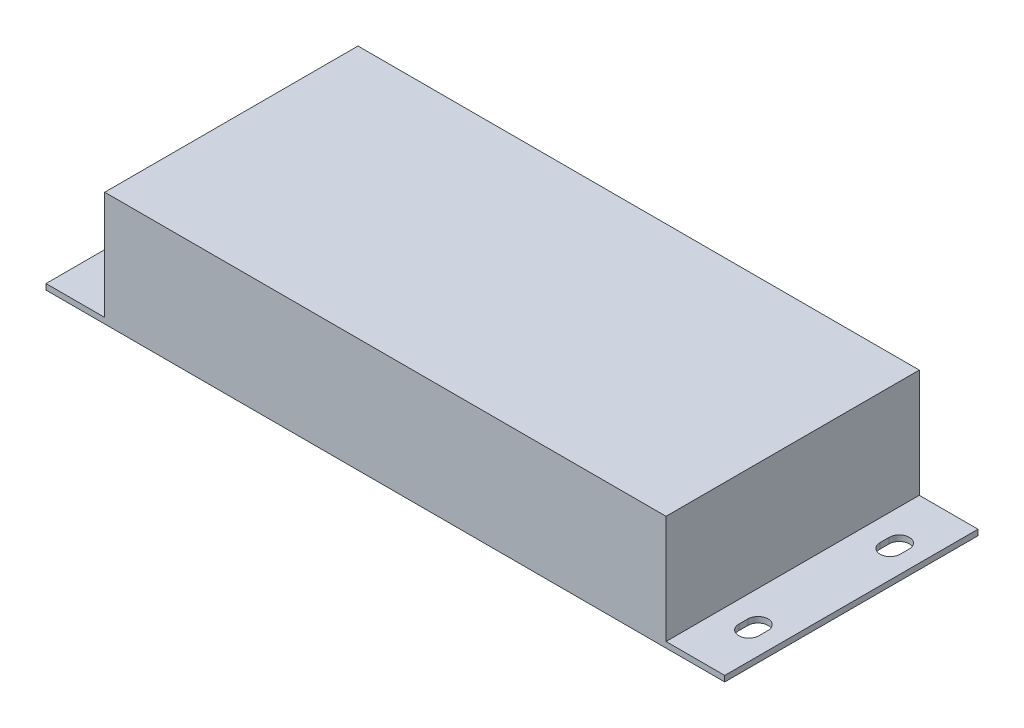
ISO-10303-21;
HEADER;
FILE_DESCRIPTION(('STEP AP214'),'2;1');
FILE_NAME('part.step','',(''),(''),'','','');
FILE_SCHEMA(('AUTOMOTIVE_DESIGN { 1 0 10303 214 1 1 1 1 }'));
ENDSEC;
DATA;
#1=APPLICATION_CONTEXT('core data for automotive mechanical design processes');
#2=APPLICATION_PROTOCOL_DEFINITION('international standard','automotive_design',2000,#1);
#3=PRODUCT_CONTEXT('',#1,'mechanical');
#4=PRODUCT('Part','Part','',(#3));
#5=PRODUCT_RELATED_PRODUCT_CATEGORY('part','',(#4));
#6=PRODUCT_DEFINITION_FORMATION('','',#4);
#7=PRODUCT_DEFINITION_CONTEXT('part definition',#1,'design');
#8=PRODUCT_DEFINITION('design','',#6,#7);
#9=PRODUCT_DEFINITION_SHAPE('','',#8);
#10=(LENGTH_UNIT() NAMED_UNIT(*) SI_UNIT(.MILLI.,.METRE.));
#11=(NAMED_UNIT(*) PLANE_ANGLE_UNIT() SI_UNIT($,.RADIAN.));
#12=(NAMED_UNIT(*) SI_UNIT($,.STERADIAN.) SOLID_ANGLE_UNIT());
#13=UNCERTAINTY_MEASURE_WITH_UNIT(LENGTH_MEASURE(1.E-05),#10,'distance_accuracy_value','');
#14=(GEOMETRIC_REPRESENTATION_CONTEXT(3) GLOBAL_UNCERTAINTY_ASSIGNED_CONTEXT((#13)) GLOBAL_UNIT_ASSIGNED_CONTEXT((#10,
#11,#12)) REPRESENTATION_CONTEXT('',''));
#15=CARTESIAN_POINT('',(0.,0.,0.));
#16=DIRECTION('',(0.,0.,1.));
#17=DIRECTION('',(1.,0.,0.));
#18=AXIS2_PLACEMENT_3D('',#15,#16,#17);
#19=CARTESIAN_POINT('',(0.,19.304,0.));
#20=DIRECTION('',(1.,0.,0.));
#21=DIRECTION('',(0.,0.,-1.));
#22=AXIS2_PLACEMENT_3D('',#19,#20,#21);
#23=PLANE('',#22);
#24=DIRECTION('',(0.,0.,1.));
#25=VECTOR('',#24,1.);
#26=CARTESIAN_POINT('',(0.,0.,0.));
#27=LINE('',#26,#25);
#28=CARTESIAN_POINT('',(0.,0.,-45.085));
#29=VERTEX_POINT('',#28);
#30=CARTESIAN_POINT('',(0.,0.,0.));
#31=VERTEX_POINT('',#30);
#32=EDGE_CURVE('E111',#29,#31,#27,.T.);
#33=ORIENTED_EDGE('',*,*,#32,.T.);
#34=DIRECTION('',(0.,-1.,0.));
#35=VECTOR('',#34,1.);
#36=CARTESIAN_POINT('',(0.,19.304,0.));
#37=LINE('',#36,#35);
#38=CARTESIAN_POINT('',(0.,19.304,0.));
#39=VERTEX_POINT('',#38);
#40=EDGE_CURVE('E11',#39,#31,#37,.T.);
#41=ORIENTED_EDGE('',*,*,#40,.F.);
#42=DIRECTION('',(0.,0.,1.));
#43=VECTOR('',#42,1.);
#44=CARTESIAN_POINT('',(0.,19.304,0.));
#45=LINE('',#44,#43);
#46=CARTESIAN_POINT('',(0.,19.304,-45.085));
#47=VERTEX_POINT('',#46);
#48=EDGE_CURVE('E92',#47,#39,#45,.T.);
#49=ORIENTED_EDGE('',*,*,#48,.F.);
#50=DIRECTION('',(0.,-1.,0.));
#51=VECTOR('',#50,1.);
#52=CARTESIAN_POINT('',(0.,19.304,-45.085));
#53=LINE('',#52,#51);
#54=EDGE_CURVE('E107',#47,#29,#53,.T.);
#55=ORIENTED_EDGE('',*,*,#54,.T.);
#56=EDGE_LOOP('',(#33,#41,#49,#55));
#57=FACE_BOUND('',#56,.T.);
#58=ADVANCED_FACE('F33',(#57),#23,.F.);
#59=CARTESIAN_POINT('',(0.,19.304,0.));
#60=DIRECTION('',(0.,0.,-1.));
#61=DIRECTION('',(-1.,0.,0.));
#62=AXIS2_PLACEMENT_3D('',#59,#60,#61);
#63=PLANE('',#62);
#64=ORIENTED_EDGE('',*,*,#40,.T.);
#65=DIRECTION('',(-1.,0.,0.));
#66=VECTOR('',#65,1.);
#67=CARTESIAN_POINT('',(-10.4521,0.,0.));
#68=LINE('',#67,#66);
#69=CARTESIAN_POINT('',(-10.4521,0.,0.));
#70=VERTEX_POINT('',#69);
#71=EDGE_CURVE('E80',#31,#70,#68,.T.);
#72=ORIENTED_EDGE('',*,*,#71,.T.);
#73=DIRECTION('',(0.,1.,0.));
#74=VECTOR('',#73,1.);
#75=CARTESIAN_POINT('',(-10.4521,-1.016,0.));
#76=LINE('',#75,#74);
#77=CARTESIAN_POINT('',(-10.4521,-1.016,0.));
#78=VERTEX_POINT('',#77);
#79=EDGE_CURVE('E131',#78,#70,#76,.T.);
#80=ORIENTED_EDGE('',*,*,#79,.F.);
#81=DIRECTION('',(-1.,0.,0.));
#82=VECTOR('',#81,1.);
#83=CARTESIAN_POINT('',(-10.4521,-1.016,0.));
#84=LINE('',#83,#82);
#85=CARTESIAN_POINT('',(110.3757,-1.016,0.));
#86=VERTEX_POINT('',#85);
#87=EDGE_CURVE('E154',#86,#78,#84,.T.);
#88=ORIENTED_EDGE('',*,*,#87,.F.);
#89=DIRECTION('',(0.,1.,0.));
#90=VECTOR('',#89,1.);
#91=CARTESIAN_POINT('',(110.3757,-1.016,0.));
#92=LINE('',#91,#90);
#93=CARTESIAN_POINT('',(110.3757,0.,0.));
#94=VERTEX_POINT('',#93);
#95=EDGE_CURVE('E115',#86,#94,#92,.T.);
#96=ORIENTED_EDGE('',*,*,#95,.T.);
#97=CARTESIAN_POINT('',(99.9236,0.,0.));
#98=VERTEX_POINT('',#97);
#99=EDGE_CURVE('E101',#94,#98,#68,.T.);
#100=ORIENTED_EDGE('',*,*,#99,.T.);
#101=DIRECTION('',(0.,-1.,0.));
#102=VECTOR('',#101,1.);
#103=CARTESIAN_POINT('',(99.9236,19.304,0.));
#104=LINE('',#103,#102);
#105=CARTESIAN_POINT('',(99.9236,19.304,0.));
#106=VERTEX_POINT('',#105);
#107=EDGE_CURVE('E40',#106,#98,#104,.T.);
#108=ORIENTED_EDGE('',*,*,#107,.F.);
#109=DIRECTION('',(1.,0.,0.));
#110=VECTOR('',#109,1.);
#111=CARTESIAN_POINT('',(0.,19.304,0.));
#112=LINE('',#111,#110);
#113=EDGE_CURVE('E85',#39,#106,#112,.T.);
#114=ORIENTED_EDGE('',*,*,#113,.F.);
#115=EDGE_LOOP('',(#64,#72,#80,#88,#96,#100,#108,#114));
#116=FACE_BOUND('',#115,.T.);
#117=ADVANCED_FACE('F98',(#116),#63,.F.);
#118=CARTESIAN_POINT('',(99.9236,19.304,0.));
#119=DIRECTION('',(-1.,0.,0.));
#120=DIRECTION('',(0.,0.,1.));
#121=AXIS2_PLACEMENT_3D('',#118,#119,#120);
#122=PLANE('',#121);
#123=DIRECTION('',(0.,0.,-1.));
#124=VECTOR('',#123,1.);
#125=CARTESIAN_POINT('',(99.9236,0.,0.));
#126=LINE('',#125,#124);
#127=CARTESIAN_POINT('',(99.9236,0.,-45.085));
#128=VERTEX_POINT('',#127);
#129=EDGE_CURVE('E114',#98,#128,#126,.T.);
#130=ORIENTED_EDGE('',*,*,#129,.T.);
#131=DIRECTION('',(0.,-1.,0.));
#132=VECTOR('',#131,1.);
#133=CARTESIAN_POINT('',(99.9236,19.304,-45.085));
#134=LINE('',#133,#132);
#135=CARTESIAN_POINT('',(99.9236,19.304,-45.085));
#136=VERTEX_POINT('',#135);
#137=EDGE_CURVE('E103',#136,#128,#134,.T.);
#138=ORIENTED_EDGE('',*,*,#137,.F.);
#139=DIRECTION('',(0.,0.,-1.));
#140=VECTOR('',#139,1.);
#141=CARTESIAN_POINT('',(99.9236,19.304,0.));
#142=LINE('',#141,#140);
#143=EDGE_CURVE('E89',#106,#136,#142,.T.);
#144=ORIENTED_EDGE('',*,*,#143,.F.);
#145=ORIENTED_EDGE('',*,*,#107,.T.);
#146=EDGE_LOOP('',(#130,#138,#144,#145));
#147=FACE_BOUND('',#146,.T.);
#148=ADVANCED_FACE('F104',(#147),#122,.F.);
#149=CARTESIAN_POINT('',(0.,19.304,-45.085));
#150=DIRECTION('',(0.,0.,1.));
#151=DIRECTION('',(1.,0.,0.));
#152=AXIS2_PLACEMENT_3D('',#149,#150,#151);
#153=PLANE('',#152);
#154=DIRECTION('',(-1.,0.,0.));
#155=VECTOR('',#154,1.);
#156=CARTESIAN_POINT('',(6.67170322778393,6.76181366277185,-45.085));
#157=LINE('',#156,#155);
#158=CARTESIAN_POINT('',(93.251896772216,6.76181366277185,-45.085));
#159=VERTEX_POINT('',#158);
#160=CARTESIAN_POINT('',(6.67170322778393,6.76181366277185,-45.085));
#161=VERTEX_POINT('',#160);
#162=EDGE_CURVE('E320',#159,#161,#157,.T.);
#163=ORIENTED_EDGE('',*,*,#162,.F.);
#164=DIRECTION('',(0.,-1.,0.));
#165=VECTOR('',#164,1.);
#166=CARTESIAN_POINT('',(93.251896772216,6.76181366277185,-45.085));
#167=LINE('',#166,#165);
#168=CARTESIAN_POINT('',(93.251896772216,12.5421863372281,-45.085));
#169=VERTEX_POINT('',#168);
#170=EDGE_CURVE('E47',#169,#159,#167,.T.);
#171=ORIENTED_EDGE('',*,*,#170,.F.);
#172=DIRECTION('',(1.,0.,0.));
#173=VECTOR('',#172,1.);
#174=CARTESIAN_POINT('',(6.67170322778393,12.5421863372281,-45.085));
#175=LINE('',#174,#173);
#176=CARTESIAN_POINT('',(6.67170322778393,12.5421863372281,-45.085));
#177=VERTEX_POINT('',#176);
#178=EDGE_CURVE('E313',#177,#169,#175,.T.);
#179=ORIENTED_EDGE('',*,*,#178,.F.);
#180=DIRECTION('',(0.,1.,0.));
#181=VECTOR('',#180,1.);
#182=CARTESIAN_POINT('',(6.67170322778393,6.76181366277185,-45.085));
#183=LINE('',#182,#181);
#184=EDGE_CURVE('E317',#161,#177,#183,.T.);
#185=ORIENTED_EDGE('',*,*,#184,.F.);
#186=EDGE_LOOP('',(#163,#171,#179,#185));
#187=FACE_BOUND('',#186,.T.);
#188=ORIENTED_EDGE('',*,*,#137,.T.);
#189=DIRECTION('',(1.,0.,0.));
#190=VECTOR('',#189,1.);
#191=CARTESIAN_POINT('',(-10.4521,0.,-45.085));
#192=LINE('',#191,#190);
#193=CARTESIAN_POINT('',(110.3757,0.,-45.085));
#194=VERTEX_POINT('',#193);
#195=EDGE_CURVE('E69',#128,#194,#192,.T.);
#196=ORIENTED_EDGE('',*,*,#195,.T.);
#197=DIRECTION('',(0.,1.,0.));
#198=VECTOR('',#197,1.);
#199=CARTESIAN_POINT('',(110.3757,-1.016,-45.085));
#200=LINE('',#199,#198);
#201=CARTESIAN_POINT('',(110.3757,-1.016,-45.085));
#202=VERTEX_POINT('',#201);
#203=EDGE_CURVE('E136',#202,#194,#200,.T.);
#204=ORIENTED_EDGE('',*,*,#203,.F.);
#205=DIRECTION('',(1.,0.,0.));
#206=VECTOR('',#205,1.);
#207=CARTESIAN_POINT('',(-10.4521,-1.016,-45.085));
#208=LINE('',#207,#206);
#209=CARTESIAN_POINT('',(-10.4521,-1.016,-45.085));
#210=VERTEX_POINT('',#209);
#211=EDGE_CURVE('E138',#210,#202,#208,.T.);
#212=ORIENTED_EDGE('',*,*,#211,.F.);
#213=DIRECTION('',(0.,1.,0.));
#214=VECTOR('',#213,1.);
#215=CARTESIAN_POINT('',(-10.4521,-1.016,-45.085));
#216=LINE('',#215,#214);
#217=CARTESIAN_POINT('',(-10.4521,0.,-45.085));
#218=VERTEX_POINT('',#217);
#219=EDGE_CURVE('E134',#210,#218,#216,.T.);
#220=ORIENTED_EDGE('',*,*,#219,.T.);
#221=EDGE_CURVE('E127',#218,#29,#192,.T.);
#222=ORIENTED_EDGE('',*,*,#221,.T.);
#223=ORIENTED_EDGE('',*,*,#54,.F.);
#224=DIRECTION('',(-1.,0.,0.));
#225=VECTOR('',#224,1.);
#226=CARTESIAN_POINT('',(0.,19.304,-45.085));
#227=LINE('',#226,#225);
#228=EDGE_CURVE('E56',#136,#47,#227,.T.);
#229=ORIENTED_EDGE('',*,*,#228,.F.);
#230=EDGE_LOOP('',(#188,#196,#204,#212,#220,#222,#223,#229));
#231=FACE_BOUND('',#230,.T.);
#232=ADVANCED_FACE('F120',(#187,#231),#153,.F.);
#233=CARTESIAN_POINT('',(0.,19.304,0.));
#234=DIRECTION('',(0.,-1.,0.));
#235=DIRECTION('',(0.,0.,-1.));
#236=AXIS2_PLACEMENT_3D('',#233,#234,#235);
#237=PLANE('',#236);
#238=ORIENTED_EDGE('',*,*,#48,.T.);
#239=ORIENTED_EDGE('',*,*,#113,.T.);
#240=ORIENTED_EDGE('',*,*,#143,.T.);
#241=ORIENTED_EDGE('',*,*,#228,.T.);
#242=EDGE_LOOP('',(#238,#239,#240,#241));
#243=FACE_BOUND('',#242,.T.);
#244=ADVANCED_FACE('F87',(#243),#237,.F.);
#245=CARTESIAN_POINT('',(0.,0.,0.));
#246=DIRECTION('',(0.,1.,0.));
#247=DIRECTION('',(0.,0.,1.));
#248=AXIS2_PLACEMENT_3D('',#245,#246,#247);
#249=PLANE('',#248);
#250=DIRECTION('',(0.,0.,-1.));
#251=VECTOR('',#250,1.);
#252=CARTESIAN_POINT('',(-7.37870000000001,0.,-35.9283));
#253=LINE('',#252,#251);
#254=CARTESIAN_POINT('',(-7.37870000000001,0.,-34.3027));
#255=VERTEX_POINT('',#254);
#256=CARTESIAN_POINT('',(-7.37870000000001,0.,-35.9283));
#257=VERTEX_POINT('',#256);
#258=EDGE_CURVE('E207',#255,#257,#253,.T.);
#259=ORIENTED_EDGE('',*,*,#258,.T.);
#260=CARTESIAN_POINT('',(-5.58800000000001,0.,-35.9283));
#261=DIRECTION('',(0.,-1.,0.));
#262=DIRECTION('',(0.,0.,1.));
#263=AXIS2_PLACEMENT_3D('',#260,#261,#262);
#264=CIRCLE('',#263,1.7907);
#265=CARTESIAN_POINT('',(-3.79730000000001,0.,-35.9283));
#266=VERTEX_POINT('',#265);
#267=EDGE_CURVE('E217',#257,#266,#264,.T.);
#268=ORIENTED_EDGE('',*,*,#267,.T.);
#269=DIRECTION('',(0.,0.,1.));
#270=VECTOR('',#269,1.);
#271=CARTESIAN_POINT('',(-3.79730000000001,0.,-35.9283));
#272=LINE('',#271,#270);
#273=CARTESIAN_POINT('',(-3.79730000000001,0.,-34.3027));
#274=VERTEX_POINT('',#273);
#275=EDGE_CURVE('E214',#266,#274,#272,.T.);
#276=ORIENTED_EDGE('',*,*,#275,.T.);
#277=CARTESIAN_POINT('',(-5.58800000000001,0.,-34.3027));
#278=DIRECTION('',(0.,-1.,0.));
#279=DIRECTION('',(0.,0.,1.));
#280=AXIS2_PLACEMENT_3D('',#277,#278,#279);
#281=CIRCLE('',#280,1.7907);
#282=EDGE_CURVE('E211',#274,#255,#281,.T.);
#283=ORIENTED_EDGE('',*,*,#282,.T.);
#284=EDGE_LOOP('',(#259,#268,#276,#283));
#285=FACE_BOUND('',#284,.T.);
#286=DIRECTION('',(0.,0.,1.));
#287=VECTOR('',#286,1.);
#288=CARTESIAN_POINT('',(-3.79730000000001,0.,-9.1567));
#289=LINE('',#288,#287);
#290=CARTESIAN_POINT('',(-3.79730000000001,0.,-10.7823));
#291=VERTEX_POINT('',#290);
#292=CARTESIAN_POINT('',(-3.79730000000001,0.,-9.1567));
#293=VERTEX_POINT('',#292);
#294=EDGE_CURVE('E171',#291,#293,#289,.T.);
#295=ORIENTED_EDGE('',*,*,#294,.T.);
#296=CARTESIAN_POINT('',(-5.58800000000001,0.,-9.1567));
#297=DIRECTION('',(0.,-1.,0.));
#298=DIRECTION('',(0.,0.,-1.));
#299=AXIS2_PLACEMENT_3D('',#296,#297,#298);
#300=CIRCLE('',#299,1.7907);
#301=CARTESIAN_POINT('',(-7.3787,0.,-9.1567));
#302=VERTEX_POINT('',#301);
#303=EDGE_CURVE('E181',#293,#302,#300,.T.);
#304=ORIENTED_EDGE('',*,*,#303,.T.);
#305=DIRECTION('',(0.,0.,-1.));
#306=VECTOR('',#305,1.);
#307=CARTESIAN_POINT('',(-7.3787,0.,-9.1567));
#308=LINE('',#307,#306);
#309=CARTESIAN_POINT('',(-7.37870000000001,0.,-10.7823));
#310=VERTEX_POINT('',#309);
#311=EDGE_CURVE('E178',#302,#310,#308,.T.);
#312=ORIENTED_EDGE('',*,*,#311,.T.);
#313=CARTESIAN_POINT('',(-5.58800000000001,0.,-10.7823));
#314=DIRECTION('',(0.,-1.,0.));
#315=DIRECTION('',(0.,0.,-1.));
#316=AXIS2_PLACEMENT_3D('',#313,#314,#315);
#317=CIRCLE('',#316,1.7907);
#318=EDGE_CURVE('E175',#310,#291,#317,.T.);
#319=ORIENTED_EDGE('',*,*,#318,.T.);
#320=EDGE_LOOP('',(#295,#304,#312,#319));
#321=FACE_BOUND('',#320,.T.);
#322=ORIENTED_EDGE('',*,*,#32,.F.);
#323=ORIENTED_EDGE('',*,*,#221,.F.);
#324=DIRECTION('',(0.,0.,-1.));
#325=VECTOR('',#324,1.);
#326=CARTESIAN_POINT('',(-10.4521,0.,-45.085));
#327=LINE('',#326,#325);
#328=EDGE_CURVE('E141',#70,#218,#327,.T.);
#329=ORIENTED_EDGE('',*,*,#328,.F.);
#330=ORIENTED_EDGE('',*,*,#71,.F.);
#331=EDGE_LOOP('',(#322,#323,#329,#330));
#332=FACE_BOUND('',#331,.T.);
#333=ADVANCED_FACE('F448',(#285,#321,#332),#249,.T.);
#334=DIRECTION('',(0.,0.,-1.));
#335=VECTOR('',#334,1.);
#336=CARTESIAN_POINT('',(103.7209,0.,-35.9283));
#337=LINE('',#336,#335);
#338=CARTESIAN_POINT('',(103.7209,0.,-34.3027));
#339=VERTEX_POINT('',#338);
#340=CARTESIAN_POINT('',(103.7209,0.,-35.9283));
#341=VERTEX_POINT('',#340);
#342=EDGE_CURVE('E279',#339,#341,#337,.T.);
#343=ORIENTED_EDGE('',*,*,#342,.T.);
#344=CARTESIAN_POINT('',(105.5116,0.,-35.9283));
#345=DIRECTION('',(0.,-1.,0.));
#346=DIRECTION('',(0.,0.,-1.));
#347=AXIS2_PLACEMENT_3D('',#344,#345,#346);
#348=CIRCLE('',#347,1.79070000000001);
#349=CARTESIAN_POINT('',(107.3023,0.,-35.9283));
#350=VERTEX_POINT('',#349);
#351=EDGE_CURVE('E289',#341,#350,#348,.T.);
#352=ORIENTED_EDGE('',*,*,#351,.T.);
#353=DIRECTION('',(0.,0.,1.));
#354=VECTOR('',#353,1.);
#355=CARTESIAN_POINT('',(107.3023,0.,-35.9283));
#356=LINE('',#355,#354);
#357=CARTESIAN_POINT('',(107.3023,0.,-34.3027));
#358=VERTEX_POINT('',#357);
#359=EDGE_CURVE('E286',#350,#358,#356,.T.);
#360=ORIENTED_EDGE('',*,*,#359,.T.);
#361=CARTESIAN_POINT('',(105.5116,0.,-34.3027));
#362=DIRECTION('',(0.,-1.,0.));
#363=DIRECTION('',(0.,0.,-1.));
#364=AXIS2_PLACEMENT_3D('',#361,#362,#363);
#365=CIRCLE('',#364,1.7907);
#366=EDGE_CURVE('E283',#358,#339,#365,.T.);
#367=ORIENTED_EDGE('',*,*,#366,.T.);
#368=EDGE_LOOP('',(#343,#352,#360,#367));
#369=FACE_BOUND('',#368,.T.);
#370=DIRECTION('',(0.,0.,1.));
#371=VECTOR('',#370,1.);
#372=CARTESIAN_POINT('',(107.3023,0.,-9.1567));
#373=LINE('',#372,#371);
#374=CARTESIAN_POINT('',(107.3023,0.,-10.7823));
#375=VERTEX_POINT('',#374);
#376=CARTESIAN_POINT('',(107.3023,0.,-9.1567));
#377=VERTEX_POINT('',#376);
#378=EDGE_CURVE('E243',#375,#377,#373,.T.);
#379=ORIENTED_EDGE('',*,*,#378,.T.);
#380=CARTESIAN_POINT('',(105.5116,0.,-9.1567));
#381=DIRECTION('',(0.,-1.,0.));
#382=DIRECTION('',(0.,0.,1.));
#383=AXIS2_PLACEMENT_3D('',#380,#381,#382);
#384=CIRCLE('',#383,1.79069999999999);
#385=CARTESIAN_POINT('',(103.7209,0.,-9.1567));
#386=VERTEX_POINT('',#385);
#387=EDGE_CURVE('E253',#377,#386,#384,.T.);
#388=ORIENTED_EDGE('',*,*,#387,.T.);
#389=DIRECTION('',(0.,0.,-1.));
#390=VECTOR('',#389,1.);
#391=CARTESIAN_POINT('',(103.7209,0.,-9.1567));
#392=LINE('',#391,#390);
#393=CARTESIAN_POINT('',(103.7209,0.,-10.7823));
#394=VERTEX_POINT('',#393);
#395=EDGE_CURVE('E250',#386,#394,#392,.T.);
#396=ORIENTED_EDGE('',*,*,#395,.T.);
#397=CARTESIAN_POINT('',(105.5116,0.,-10.7823));
#398=DIRECTION('',(0.,-1.,0.));
#399=DIRECTION('',(0.,0.,1.));
#400=AXIS2_PLACEMENT_3D('',#397,#398,#399);
#401=CIRCLE('',#400,1.7907);
#402=EDGE_CURVE('E247',#394,#375,#401,.T.);
#403=ORIENTED_EDGE('',*,*,#402,.T.);
#404=EDGE_LOOP('',(#379,#388,#396,#403));
#405=FACE_BOUND('',#404,.T.);
#406=ORIENTED_EDGE('',*,*,#129,.F.);
#407=ORIENTED_EDGE('',*,*,#99,.F.);
#408=DIRECTION('',(0.,0.,1.));
#409=VECTOR('',#408,1.);
#410=CARTESIAN_POINT('',(110.3757,0.,-45.085));
#411=LINE('',#410,#409);
#412=EDGE_CURVE('E145',#194,#94,#411,.T.);
#413=ORIENTED_EDGE('',*,*,#412,.F.);
#414=ORIENTED_EDGE('',*,*,#195,.F.);
#415=EDGE_LOOP('',(#406,#407,#413,#414));
#416=FACE_BOUND('',#415,.T.);
#417=ADVANCED_FACE('F462',(#369,#405,#416),#249,.T.);
#418=CARTESIAN_POINT('',(0.,-1.016,0.));
#419=DIRECTION('',(0.,1.,0.));
#420=DIRECTION('',(0.,0.,1.));
#421=AXIS2_PLACEMENT_3D('',#418,#419,#420);
#422=PLANE('',#421);
#423=CARTESIAN_POINT('',(105.5116,-1.016,-9.1567));
#424=DIRECTION('',(0.,-1.,0.));
#425=DIRECTION('',(0.,0.,1.));
#426=AXIS2_PLACEMENT_3D('',#423,#424,#425);
#427=CIRCLE('',#426,1.79069999999999);
#428=CARTESIAN_POINT('',(107.3023,-1.016,-9.1567));
#429=VERTEX_POINT('',#428);
#430=CARTESIAN_POINT('',(103.7209,-1.016,-9.1567));
#431=VERTEX_POINT('',#430);
#432=EDGE_CURVE('E246',#429,#431,#427,.T.);
#433=ORIENTED_EDGE('',*,*,#432,.F.);
#434=DIRECTION('',(0.,0.,1.));
#435=VECTOR('',#434,1.);
#436=CARTESIAN_POINT('',(107.3023,-1.016,-9.1567));
#437=LINE('',#436,#435);
#438=CARTESIAN_POINT('',(107.3023,-1.016,-10.7823));
#439=VERTEX_POINT('',#438);
#440=EDGE_CURVE('E242',#439,#429,#437,.T.);
#441=ORIENTED_EDGE('',*,*,#440,.F.);
#442=CARTESIAN_POINT('',(105.5116,-1.016,-10.7823));
#443=DIRECTION('',(0.,-1.,0.));
#444=DIRECTION('',(0.,0.,1.));
#445=AXIS2_PLACEMENT_3D('',#442,#443,#444);
#446=CIRCLE('',#445,1.7907);
#447=CARTESIAN_POINT('',(103.7209,-1.016,-10.7823));
#448=VERTEX_POINT('',#447);
#449=EDGE_CURVE('E259',#448,#439,#446,.T.);
#450=ORIENTED_EDGE('',*,*,#449,.F.);
#451=DIRECTION('',(0.,0.,-1.));
#452=VECTOR('',#451,1.);
#453=CARTESIAN_POINT('',(103.7209,-1.016,-9.1567));
#454=LINE('',#453,#452);
#455=EDGE_CURVE('E262',#431,#448,#454,.T.);
#456=ORIENTED_EDGE('',*,*,#455,.F.);
#457=EDGE_LOOP('',(#433,#441,#450,#456));
#458=FACE_BOUND('',#457,.T.);
#459=CARTESIAN_POINT('',(-5.58800000000001,-1.016,-9.1567));
#460=DIRECTION('',(0.,-1.,0.));
#461=DIRECTION('',(0.,0.,-1.));
#462=AXIS2_PLACEMENT_3D('',#459,#460,#461);
#463=CIRCLE('',#462,1.7907);
#464=CARTESIAN_POINT('',(-3.79730000000001,-1.016,-9.1567));
#465=VERTEX_POINT('',#464);
#466=CARTESIAN_POINT('',(-7.3787,-1.016,-9.1567));
#467=VERTEX_POINT('',#466);
#468=EDGE_CURVE('E174',#465,#467,#463,.T.);
#469=ORIENTED_EDGE('',*,*,#468,.F.);
#470=DIRECTION('',(0.,0.,1.));
#471=VECTOR('',#470,1.);
#472=CARTESIAN_POINT('',(-3.79730000000001,-1.016,-9.1567));
#473=LINE('',#472,#471);
#474=CARTESIAN_POINT('',(-3.79730000000001,-1.016,-10.7823));
#475=VERTEX_POINT('',#474);
#476=EDGE_CURVE('E170',#475,#465,#473,.T.);
#477=ORIENTED_EDGE('',*,*,#476,.F.);
#478=CARTESIAN_POINT('',(-5.58800000000001,-1.016,-10.7823));
#479=DIRECTION('',(0.,-1.,0.));
#480=DIRECTION('',(0.,0.,-1.));
#481=AXIS2_PLACEMENT_3D('',#478,#479,#480);
#482=CIRCLE('',#481,1.7907);
#483=CARTESIAN_POINT('',(-7.37870000000001,-1.016,-10.7823));
#484=VERTEX_POINT('',#483);
#485=EDGE_CURVE('E187',#484,#475,#482,.T.);
#486=ORIENTED_EDGE('',*,*,#485,.F.);
#487=DIRECTION('',(0.,0.,-1.));
#488=VECTOR('',#487,1.);
#489=CARTESIAN_POINT('',(-7.3787,-1.016,-9.1567));
#490=LINE('',#489,#488);
#491=EDGE_CURVE('E190',#467,#484,#490,.T.);
#492=ORIENTED_EDGE('',*,*,#491,.F.);
#493=EDGE_LOOP('',(#469,#477,#486,#492));
#494=FACE_BOUND('',#493,.T.);
#495=DIRECTION('',(0.,0.,1.));
#496=VECTOR('',#495,1.);
#497=CARTESIAN_POINT('',(110.3757,-1.016,-45.085));
#498=LINE('',#497,#496);
#499=EDGE_CURVE('E140',#202,#86,#498,.T.);
#500=ORIENTED_EDGE('',*,*,#499,.T.);
#501=ORIENTED_EDGE('',*,*,#87,.T.);
#502=DIRECTION('',(0.,0.,-1.));
#503=VECTOR('',#502,1.);
#504=CARTESIAN_POINT('',(-10.4521,-1.016,-45.085));
#505=LINE('',#504,#503);
#506=EDGE_CURVE('E151',#78,#210,#505,.T.);
#507=ORIENTED_EDGE('',*,*,#506,.T.);
#508=ORIENTED_EDGE('',*,*,#211,.T.);
#509=EDGE_LOOP('',(#500,#501,#507,#508));
#510=FACE_BOUND('',#509,.T.);
#511=CARTESIAN_POINT('',(-5.58800000000001,-1.016,-35.9283));
#512=DIRECTION('',(0.,-1.,0.));
#513=DIRECTION('',(0.,0.,1.));
#514=AXIS2_PLACEMENT_3D('',#511,#512,#513);
#515=CIRCLE('',#514,1.7907);
#516=CARTESIAN_POINT('',(-7.37870000000001,-1.016,-35.9283));
#517=VERTEX_POINT('',#516);
#518=CARTESIAN_POINT('',(-3.79730000000001,-1.016,-35.9283));
#519=VERTEX_POINT('',#518);
#520=EDGE_CURVE('E210',#517,#519,#515,.T.);
#521=ORIENTED_EDGE('',*,*,#520,.F.);
#522=DIRECTION('',(0.,0.,-1.));
#523=VECTOR('',#522,1.);
#524=CARTESIAN_POINT('',(-7.37870000000001,-1.016,-35.9283));
#525=LINE('',#524,#523);
#526=CARTESIAN_POINT('',(-7.37870000000001,-1.016,-34.3027));
#527=VERTEX_POINT('',#526);
#528=EDGE_CURVE('E206',#527,#517,#525,.T.);
#529=ORIENTED_EDGE('',*,*,#528,.F.);
#530=CARTESIAN_POINT('',(-5.58800000000001,-1.016,-34.3027));
#531=DIRECTION('',(0.,-1.,0.));
#532=DIRECTION('',(0.,0.,1.));
#533=AXIS2_PLACEMENT_3D('',#530,#531,#532);
#534=CIRCLE('',#533,1.7907);
#535=CARTESIAN_POINT('',(-3.79730000000001,-1.016,-34.3027));
#536=VERTEX_POINT('',#535);
#537=EDGE_CURVE('E223',#536,#527,#534,.T.);
#538=ORIENTED_EDGE('',*,*,#537,.F.);
#539=DIRECTION('',(0.,0.,1.));
#540=VECTOR('',#539,1.);
#541=CARTESIAN_POINT('',(-3.79730000000001,-1.016,-35.9283));
#542=LINE('',#541,#540);
#543=EDGE_CURVE('E226',#519,#536,#542,.T.);
#544=ORIENTED_EDGE('',*,*,#543,.F.);
#545=EDGE_LOOP('',(#521,#529,#538,#544));
#546=FACE_BOUND('',#545,.T.);
#547=CARTESIAN_POINT('',(105.5116,-1.016,-35.9283));
#548=DIRECTION('',(0.,-1.,0.));
#549=DIRECTION('',(0.,0.,-1.));
#550=AXIS2_PLACEMENT_3D('',#547,#548,#549);
#551=CIRCLE('',#550,1.79070000000001);
#552=CARTESIAN_POINT('',(103.7209,-1.016,-35.9283));
#553=VERTEX_POINT('',#552);
#554=CARTESIAN_POINT('',(107.3023,-1.016,-35.9283));
#555=VERTEX_POINT('',#554);
#556=EDGE_CURVE('E282',#553,#555,#551,.T.);
#557=ORIENTED_EDGE('',*,*,#556,.F.);
#558=DIRECTION('',(0.,0.,-1.));
#559=VECTOR('',#558,1.);
#560=CARTESIAN_POINT('',(103.7209,-1.016,-35.9283));
#561=LINE('',#560,#559);
#562=CARTESIAN_POINT('',(103.7209,-1.016,-34.3027));
#563=VERTEX_POINT('',#562);
#564=EDGE_CURVE('E278',#563,#553,#561,.T.);
#565=ORIENTED_EDGE('',*,*,#564,.F.);
#566=CARTESIAN_POINT('',(105.5116,-1.016,-34.3027));
#567=DIRECTION('',(0.,-1.,0.));
#568=DIRECTION('',(0.,0.,-1.));
#569=AXIS2_PLACEMENT_3D('',#566,#567,#568);
#570=CIRCLE('',#569,1.7907);
#571=CARTESIAN_POINT('',(107.3023,-1.016,-34.3027));
#572=VERTEX_POINT('',#571);
#573=EDGE_CURVE('E295',#572,#563,#570,.T.);
#574=ORIENTED_EDGE('',*,*,#573,.F.);
#575=DIRECTION('',(0.,0.,1.));
#576=VECTOR('',#575,1.);
#577=CARTESIAN_POINT('',(107.3023,-1.016,-35.9283));
#578=LINE('',#577,#576);
#579=EDGE_CURVE('E298',#555,#572,#578,.T.);
#580=ORIENTED_EDGE('',*,*,#579,.F.);
#581=EDGE_LOOP('',(#557,#565,#574,#580));
#582=FACE_BOUND('',#581,.T.);
#583=ADVANCED_FACE('F457',(#458,#494,#510,#546,#582),#422,.F.);
#584=CARTESIAN_POINT('',(110.3757,-1.016,-45.085));
#585=DIRECTION('',(-1.,0.,0.));
#586=DIRECTION('',(0.,0.,1.));
#587=AXIS2_PLACEMENT_3D('',#584,#585,#586);
#588=PLANE('',#587);
#589=ORIENTED_EDGE('',*,*,#412,.T.);
#590=ORIENTED_EDGE('',*,*,#95,.F.);
#591=ORIENTED_EDGE('',*,*,#499,.F.);
#592=ORIENTED_EDGE('',*,*,#203,.T.);
#593=EDGE_LOOP('',(#589,#590,#591,#592));
#594=FACE_BOUND('',#593,.T.);
#595=ADVANCED_FACE('F461',(#594),#588,.F.);
#596=CARTESIAN_POINT('',(-10.4521,-1.016,-45.085));
#597=DIRECTION('',(1.,0.,0.));
#598=DIRECTION('',(0.,0.,-1.));
#599=AXIS2_PLACEMENT_3D('',#596,#597,#598);
#600=PLANE('',#599);
#601=ORIENTED_EDGE('',*,*,#328,.T.);
#602=ORIENTED_EDGE('',*,*,#219,.F.);
#603=ORIENTED_EDGE('',*,*,#506,.F.);
#604=ORIENTED_EDGE('',*,*,#79,.T.);
#605=EDGE_LOOP('',(#601,#602,#603,#604));
#606=FACE_BOUND('',#605,.T.);
#607=ADVANCED_FACE('F451',(#606),#600,.F.);
#608=CARTESIAN_POINT('',(-5.58800000000001,-1.016,-9.1567));
#609=DIRECTION('',(0.,1.,0.));
#610=DIRECTION('',(0.,0.,1.));
#611=AXIS2_PLACEMENT_3D('',#608,#609,#610);
#612=CYLINDRICAL_SURFACE('',#611,1.7907);
#613=ORIENTED_EDGE('',*,*,#303,.F.);
#614=DIRECTION('',(0.,1.,0.));
#615=VECTOR('',#614,1.);
#616=CARTESIAN_POINT('',(-3.79730000000001,-1.016,-9.1567));
#617=LINE('',#616,#615);
#618=EDGE_CURVE('E167',#465,#293,#617,.T.);
#619=ORIENTED_EDGE('',*,*,#618,.F.);
#620=ORIENTED_EDGE('',*,*,#468,.T.);
#621=DIRECTION('',(0.,1.,0.));
#622=VECTOR('',#621,1.);
#623=CARTESIAN_POINT('',(-7.3787,-1.016,-9.1567));
#624=LINE('',#623,#622);
#625=EDGE_CURVE('E148',#467,#302,#624,.T.);
#626=ORIENTED_EDGE('',*,*,#625,.T.);
#627=EDGE_LOOP('',(#613,#619,#620,#626));
#628=FACE_BOUND('',#627,.T.);
#629=ADVANCED_FACE('F491',(#628),#612,.F.);
#630=CARTESIAN_POINT('',(-7.3787,-1.016,-9.1567));
#631=DIRECTION('',(1.,0.,0.));
#632=DIRECTION('',(0.,0.,-1.));
#633=AXIS2_PLACEMENT_3D('',#630,#631,#632);
#634=PLANE('',#633);
#635=ORIENTED_EDGE('',*,*,#311,.F.);
#636=ORIENTED_EDGE('',*,*,#625,.F.);
#637=ORIENTED_EDGE('',*,*,#491,.T.);
#638=DIRECTION('',(0.,1.,0.));
#639=VECTOR('',#638,1.);
#640=CARTESIAN_POINT('',(-7.37870000000001,-1.016,-10.7823));
#641=LINE('',#640,#639);
#642=EDGE_CURVE('E161',#484,#310,#641,.T.);
#643=ORIENTED_EDGE('',*,*,#642,.T.);
#644=EDGE_LOOP('',(#635,#636,#637,#643));
#645=FACE_BOUND('',#644,.T.);
#646=ADVANCED_FACE('F495',(#645),#634,.T.);
#647=CARTESIAN_POINT('',(-5.58800000000001,-1.016,-10.7823));
#648=DIRECTION('',(0.,1.,0.));
#649=DIRECTION('',(0.,0.,1.));
#650=AXIS2_PLACEMENT_3D('',#647,#648,#649);
#651=CYLINDRICAL_SURFACE('',#650,1.7907);
#652=ORIENTED_EDGE('',*,*,#318,.F.);
#653=ORIENTED_EDGE('',*,*,#642,.F.);
#654=ORIENTED_EDGE('',*,*,#485,.T.);
#655=DIRECTION('',(0.,1.,0.));
#656=VECTOR('',#655,1.);
#657=CARTESIAN_POINT('',(-3.79730000000001,-1.016,-10.7823));
#658=LINE('',#657,#656);
#659=EDGE_CURVE('E164',#475,#291,#658,.T.);
#660=ORIENTED_EDGE('',*,*,#659,.T.);
#661=EDGE_LOOP('',(#652,#653,#654,#660));
#662=FACE_BOUND('',#661,.T.);
#663=ADVANCED_FACE('F501',(#662),#651,.F.);
#664=CARTESIAN_POINT('',(-3.79730000000001,-1.016,-9.1567));
#665=DIRECTION('',(-1.,0.,0.));
#666=DIRECTION('',(0.,0.,1.));
#667=AXIS2_PLACEMENT_3D('',#664,#665,#666);
#668=PLANE('',#667);
#669=ORIENTED_EDGE('',*,*,#294,.F.);
#670=ORIENTED_EDGE('',*,*,#659,.F.);
#671=ORIENTED_EDGE('',*,*,#476,.T.);
#672=ORIENTED_EDGE('',*,*,#618,.T.);
#673=EDGE_LOOP('',(#669,#670,#671,#672));
#674=FACE_BOUND('',#673,.T.);
#675=ADVANCED_FACE('F507',(#674),#668,.T.);
#676=CARTESIAN_POINT('',(-5.58800000000001,-1.016,-35.9283));
#677=DIRECTION('',(0.,1.,0.));
#678=DIRECTION('',(0.,0.,1.));
#679=AXIS2_PLACEMENT_3D('',#676,#677,#678);
#680=CYLINDRICAL_SURFACE('',#679,1.7907);
#681=ORIENTED_EDGE('',*,*,#267,.F.);
#682=DIRECTION('',(0.,1.,0.));
#683=VECTOR('',#682,1.);
#684=CARTESIAN_POINT('',(-7.37870000000001,-1.016,-35.9283));
#685=LINE('',#684,#683);
#686=EDGE_CURVE('E203',#517,#257,#685,.T.);
#687=ORIENTED_EDGE('',*,*,#686,.F.);
#688=ORIENTED_EDGE('',*,*,#520,.T.);
#689=DIRECTION('',(0.,1.,0.));
#690=VECTOR('',#689,1.);
#691=CARTESIAN_POINT('',(-3.79730000000001,-1.016,-35.9283));
#692=LINE('',#691,#690);
#693=EDGE_CURVE('E184',#519,#266,#692,.T.);
#694=ORIENTED_EDGE('',*,*,#693,.T.);
#695=EDGE_LOOP('',(#681,#687,#688,#694));
#696=FACE_BOUND('',#695,.T.);
#697=ADVANCED_FACE('F511',(#696),#680,.F.);
#698=CARTESIAN_POINT('',(-3.79730000000001,-1.016,-35.9283));
#699=DIRECTION('',(-1.,0.,0.));
#700=DIRECTION('',(0.,0.,1.));
#701=AXIS2_PLACEMENT_3D('',#698,#699,#700);
#702=PLANE('',#701);
#703=ORIENTED_EDGE('',*,*,#275,.F.);
#704=ORIENTED_EDGE('',*,*,#693,.F.);
#705=ORIENTED_EDGE('',*,*,#543,.T.);
#706=DIRECTION('',(0.,1.,0.));
#707=VECTOR('',#706,1.);
#708=CARTESIAN_POINT('',(-3.79730000000001,-1.016,-34.3027));
#709=LINE('',#708,#707);
#710=EDGE_CURVE('E197',#536,#274,#709,.T.);
#711=ORIENTED_EDGE('',*,*,#710,.T.);
#712=EDGE_LOOP('',(#703,#704,#705,#711));
#713=FACE_BOUND('',#712,.T.);
#714=ADVANCED_FACE('F515',(#713),#702,.T.);
#715=CARTESIAN_POINT('',(-5.58800000000001,-1.016,-34.3027));
#716=DIRECTION('',(0.,1.,0.));
#717=DIRECTION('',(0.,0.,1.));
#718=AXIS2_PLACEMENT_3D('',#715,#716,#717);
#719=CYLINDRICAL_SURFACE('',#718,1.7907);
#720=ORIENTED_EDGE('',*,*,#282,.F.);
#721=ORIENTED_EDGE('',*,*,#710,.F.);
#722=ORIENTED_EDGE('',*,*,#537,.T.);
#723=DIRECTION('',(0.,1.,0.));
#724=VECTOR('',#723,1.);
#725=CARTESIAN_POINT('',(-7.37870000000001,-1.016,-34.3027));
#726=LINE('',#725,#724);
#727=EDGE_CURVE('E200',#527,#255,#726,.T.);
#728=ORIENTED_EDGE('',*,*,#727,.T.);
#729=EDGE_LOOP('',(#720,#721,#722,#728));
#730=FACE_BOUND('',#729,.T.);
#731=ADVANCED_FACE('F519',(#730),#719,.F.);
#732=CARTESIAN_POINT('',(-7.37870000000001,-1.016,-35.9283));
#733=DIRECTION('',(1.,0.,0.));
#734=DIRECTION('',(0.,0.,-1.));
#735=AXIS2_PLACEMENT_3D('',#732,#733,#734);
#736=PLANE('',#735);
#737=ORIENTED_EDGE('',*,*,#258,.F.);
#738=ORIENTED_EDGE('',*,*,#727,.F.);
#739=ORIENTED_EDGE('',*,*,#528,.T.);
#740=ORIENTED_EDGE('',*,*,#686,.T.);
#741=EDGE_LOOP('',(#737,#738,#739,#740));
#742=FACE_BOUND('',#741,.T.);
#743=ADVANCED_FACE('F523',(#742),#736,.T.);
#744=CARTESIAN_POINT('',(105.5116,-1.016,-9.1567));
#745=DIRECTION('',(0.,1.,0.));
#746=DIRECTION('',(0.,0.,1.));
#747=AXIS2_PLACEMENT_3D('',#744,#745,#746);
#748=CYLINDRICAL_SURFACE('',#747,1.79069999999999);
#749=ORIENTED_EDGE('',*,*,#387,.F.);
#750=DIRECTION('',(0.,1.,0.));
#751=VECTOR('',#750,1.);
#752=CARTESIAN_POINT('',(107.3023,-1.016,-9.1567));
#753=LINE('',#752,#751);
#754=EDGE_CURVE('E239',#429,#377,#753,.T.);
#755=ORIENTED_EDGE('',*,*,#754,.F.);
#756=ORIENTED_EDGE('',*,*,#432,.T.);
#757=DIRECTION('',(0.,1.,0.));
#758=VECTOR('',#757,1.);
#759=CARTESIAN_POINT('',(103.7209,-1.016,-9.1567));
#760=LINE('',#759,#758);
#761=EDGE_CURVE('E220',#431,#386,#760,.T.);
#762=ORIENTED_EDGE('',*,*,#761,.T.);
#763=EDGE_LOOP('',(#749,#755,#756,#762));
#764=FACE_BOUND('',#763,.T.);
#765=ADVANCED_FACE('F527',(#764),#748,.F.);
#766=CARTESIAN_POINT('',(103.7209,-1.016,-9.1567));
#767=DIRECTION('',(1.,0.,0.));
#768=DIRECTION('',(0.,0.,-1.));
#769=AXIS2_PLACEMENT_3D('',#766,#767,#768);
#770=PLANE('',#769);
#771=ORIENTED_EDGE('',*,*,#395,.F.);
#772=ORIENTED_EDGE('',*,*,#761,.F.);
#773=ORIENTED_EDGE('',*,*,#455,.T.);
#774=DIRECTION('',(0.,1.,0.));
#775=VECTOR('',#774,1.);
#776=CARTESIAN_POINT('',(103.7209,-1.016,-10.7823));
#777=LINE('',#776,#775);
#778=EDGE_CURVE('E233',#448,#394,#777,.T.);
#779=ORIENTED_EDGE('',*,*,#778,.T.);
#780=EDGE_LOOP('',(#771,#772,#773,#779));
#781=FACE_BOUND('',#780,.T.);
#782=ADVANCED_FACE('F531',(#781),#770,.T.);
#783=CARTESIAN_POINT('',(105.5116,-1.016,-10.7823));
#784=DIRECTION('',(0.,1.,0.));
#785=DIRECTION('',(0.,0.,1.));
#786=AXIS2_PLACEMENT_3D('',#783,#784,#785);
#787=CYLINDRICAL_SURFACE('',#786,1.7907);
#788=ORIENTED_EDGE('',*,*,#402,.F.);
#789=ORIENTED_EDGE('',*,*,#778,.F.);
#790=ORIENTED_EDGE('',*,*,#449,.T.);
#791=DIRECTION('',(0.,1.,0.));
#792=VECTOR('',#791,1.);
#793=CARTESIAN_POINT('',(107.3023,-1.016,-10.7823));
#794=LINE('',#793,#792);
#795=EDGE_CURVE('E236',#439,#375,#794,.T.);
#796=ORIENTED_EDGE('',*,*,#795,.T.);
#797=EDGE_LOOP('',(#788,#789,#790,#796));
#798=FACE_BOUND('',#797,.T.);
#799=ADVANCED_FACE('F535',(#798),#787,.F.);
#800=CARTESIAN_POINT('',(107.3023,-1.016,-9.1567));
#801=DIRECTION('',(-1.,0.,0.));
#802=DIRECTION('',(0.,0.,1.));
#803=AXIS2_PLACEMENT_3D('',#800,#801,#802);
#804=PLANE('',#803);
#805=ORIENTED_EDGE('',*,*,#378,.F.);
#806=ORIENTED_EDGE('',*,*,#795,.F.);
#807=ORIENTED_EDGE('',*,*,#440,.T.);
#808=ORIENTED_EDGE('',*,*,#754,.T.);
#809=EDGE_LOOP('',(#805,#806,#807,#808));
#810=FACE_BOUND('',#809,.T.);
#811=ADVANCED_FACE('F539',(#810),#804,.T.);
#812=CARTESIAN_POINT('',(105.5116,-1.016,-35.9283));
#813=DIRECTION('',(0.,1.,0.));
#814=DIRECTION('',(0.,0.,1.));
#815=AXIS2_PLACEMENT_3D('',#812,#813,#814);
#816=CYLINDRICAL_SURFACE('',#815,1.79070000000001);
#817=ORIENTED_EDGE('',*,*,#351,.F.);
#818=DIRECTION('',(0.,1.,0.));
#819=VECTOR('',#818,1.);
#820=CARTESIAN_POINT('',(103.7209,-1.016,-35.9283));
#821=LINE('',#820,#819);
#822=EDGE_CURVE('E275',#553,#341,#821,.T.);
#823=ORIENTED_EDGE('',*,*,#822,.F.);
#824=ORIENTED_EDGE('',*,*,#556,.T.);
#825=DIRECTION('',(0.,1.,0.));
#826=VECTOR('',#825,1.);
#827=CARTESIAN_POINT('',(107.3023,-1.016,-35.9283));
#828=LINE('',#827,#826);
#829=EDGE_CURVE('E256',#555,#350,#828,.T.);
#830=ORIENTED_EDGE('',*,*,#829,.T.);
#831=EDGE_LOOP('',(#817,#823,#824,#830));
#832=FACE_BOUND('',#831,.T.);
#833=ADVANCED_FACE('F543',(#832),#816,.F.);
#834=CARTESIAN_POINT('',(107.3023,-1.016,-35.9283));
#835=DIRECTION('',(-1.,0.,0.));
#836=DIRECTION('',(0.,0.,1.));
#837=AXIS2_PLACEMENT_3D('',#834,#835,#836);
#838=PLANE('',#837);
#839=ORIENTED_EDGE('',*,*,#359,.F.);
#840=ORIENTED_EDGE('',*,*,#829,.F.);
#841=ORIENTED_EDGE('',*,*,#579,.T.);
#842=DIRECTION('',(0.,1.,0.));
#843=VECTOR('',#842,1.);
#844=CARTESIAN_POINT('',(107.3023,-1.016,-34.3027));
#845=LINE('',#844,#843);
#846=EDGE_CURVE('E269',#572,#358,#845,.T.);
#847=ORIENTED_EDGE('',*,*,#846,.T.);
#848=EDGE_LOOP('',(#839,#840,#841,#847));
#849=FACE_BOUND('',#848,.T.);
#850=ADVANCED_FACE('F547',(#849),#838,.T.);
#851=CARTESIAN_POINT('',(105.5116,-1.016,-34.3027));
#852=DIRECTION('',(0.,1.,0.));
#853=DIRECTION('',(0.,0.,1.));
#854=AXIS2_PLACEMENT_3D('',#851,#852,#853);
#855=CYLINDRICAL_SURFACE('',#854,1.7907);
#856=ORIENTED_EDGE('',*,*,#366,.F.);
#857=ORIENTED_EDGE('',*,*,#846,.F.);
#858=ORIENTED_EDGE('',*,*,#573,.T.);
#859=DIRECTION('',(0.,1.,0.));
#860=VECTOR('',#859,1.);
#861=CARTESIAN_POINT('',(103.7209,-1.016,-34.3027));
#862=LINE('',#861,#860);
#863=EDGE_CURVE('E272',#563,#339,#862,.T.);
#864=ORIENTED_EDGE('',*,*,#863,.T.);
#865=EDGE_LOOP('',(#856,#857,#858,#864));
#866=FACE_BOUND('',#865,.T.);
#867=ADVANCED_FACE('F551',(#866),#855,.F.);
#868=CARTESIAN_POINT('',(103.7209,-1.016,-35.9283));
#869=DIRECTION('',(1.,0.,0.));
#870=DIRECTION('',(0.,0.,-1.));
#871=AXIS2_PLACEMENT_3D('',#868,#869,#870);
#872=PLANE('',#871);
#873=ORIENTED_EDGE('',*,*,#342,.F.);
#874=ORIENTED_EDGE('',*,*,#863,.F.);
#875=ORIENTED_EDGE('',*,*,#564,.T.);
#876=ORIENTED_EDGE('',*,*,#822,.T.);
#877=EDGE_LOOP('',(#873,#874,#875,#876));
#878=FACE_BOUND('',#877,.T.);
#879=ADVANCED_FACE('F555',(#878),#872,.T.);
#880=CARTESIAN_POINT('',(93.251896772216,6.76181366277185,-40.085));
#881=DIRECTION('',(1.,0.,0.));
#882=DIRECTION('',(0.,0.,-1.));
#883=AXIS2_PLACEMENT_3D('',#880,#881,#882);
#884=PLANE('',#883);
#885=ORIENTED_EDGE('',*,*,#170,.T.);
#886=DIRECTION('',(0.,0.,-1.));
#887=VECTOR('',#886,1.);
#888=CARTESIAN_POINT('',(93.251896772216,6.76181366277185,-40.085));
#889=LINE('',#888,#887);
#890=CARTESIAN_POINT('',(93.251896772216,6.76181366277185,-40.085));
#891=VERTEX_POINT('',#890);
#892=EDGE_CURVE('E303',#891,#159,#889,.T.);
#893=ORIENTED_EDGE('',*,*,#892,.F.);
#894=DIRECTION('',(0.,-1.,0.));
#895=VECTOR('',#894,1.);
#896=CARTESIAN_POINT('',(93.251896772216,6.76181366277185,-40.085));
#897=LINE('',#896,#895);
#898=CARTESIAN_POINT('',(93.251896772216,12.5421863372281,-40.085));
#899=VERTEX_POINT('',#898);
#900=EDGE_CURVE('E316',#899,#891,#897,.T.);
#901=ORIENTED_EDGE('',*,*,#900,.F.);
#902=DIRECTION('',(0.,0.,-1.));
#903=VECTOR('',#902,1.);
#904=CARTESIAN_POINT('',(93.251896772216,12.5421863372281,-40.085));
#905=LINE('',#904,#903);
#906=EDGE_CURVE('E292',#899,#169,#905,.T.);
#907=ORIENTED_EDGE('',*,*,#906,.T.);
#908=EDGE_LOOP('',(#885,#893,#901,#907));
#909=FACE_BOUND('',#908,.T.);
#910=ADVANCED_FACE('F343',(#909),#884,.F.);
#911=CARTESIAN_POINT('',(6.67170322778393,12.5421863372281,-40.085));
#912=DIRECTION('',(0.,1.,0.));
#913=DIRECTION('',(0.,0.,1.));
#914=AXIS2_PLACEMENT_3D('',#911,#912,#913);
#915=PLANE('',#914);
#916=ORIENTED_EDGE('',*,*,#178,.T.);
#917=ORIENTED_EDGE('',*,*,#906,.F.);
#918=DIRECTION('',(1.,0.,0.));
#919=VECTOR('',#918,1.);
#920=CARTESIAN_POINT('',(6.67170322778393,12.5421863372281,-40.085));
#921=LINE('',#920,#919);
#922=CARTESIAN_POINT('',(6.67170322778393,12.5421863372281,-40.085));
#923=VERTEX_POINT('',#922);
#924=EDGE_CURVE('E306',#923,#899,#921,.T.);
#925=ORIENTED_EDGE('',*,*,#924,.F.);
#926=DIRECTION('',(0.,0.,-1.));
#927=VECTOR('',#926,1.);
#928=CARTESIAN_POINT('',(6.67170322778393,12.5421863372281,-40.085));
#929=LINE('',#928,#927);
#930=EDGE_CURVE('E309',#923,#177,#929,.T.);
#931=ORIENTED_EDGE('',*,*,#930,.T.);
#932=EDGE_LOOP('',(#916,#917,#925,#931));
#933=FACE_BOUND('',#932,.T.);
#934=ADVANCED_FACE('F562',(#933),#915,.F.);
#935=CARTESIAN_POINT('',(6.67170322778393,6.76181366277185,-40.085));
#936=DIRECTION('',(-1.,0.,0.));
#937=DIRECTION('',(0.,0.,1.));
#938=AXIS2_PLACEMENT_3D('',#935,#936,#937);
#939=PLANE('',#938);
#940=ORIENTED_EDGE('',*,*,#184,.T.);
#941=ORIENTED_EDGE('',*,*,#930,.F.);
#942=DIRECTION('',(0.,1.,0.));
#943=VECTOR('',#942,1.);
#944=CARTESIAN_POINT('',(6.67170322778393,6.76181366277185,-40.085));
#945=LINE('',#944,#943);
#946=CARTESIAN_POINT('',(6.67170322778393,6.76181366277185,-40.085));
#947=VERTEX_POINT('',#946);
#948=EDGE_CURVE('E326',#947,#923,#945,.T.);
#949=ORIENTED_EDGE('',*,*,#948,.F.);
#950=DIRECTION('',(0.,0.,-1.));
#951=VECTOR('',#950,1.);
#952=CARTESIAN_POINT('',(6.67170322778393,6.76181366277185,-40.085));
#953=LINE('',#952,#951);
#954=EDGE_CURVE('E305',#947,#161,#953,.T.);
#955=ORIENTED_EDGE('',*,*,#954,.T.);
#956=EDGE_LOOP('',(#940,#941,#949,#955));
#957=FACE_BOUND('',#956,.T.);
#958=ADVANCED_FACE('F566',(#957),#939,.F.);
#959=CARTESIAN_POINT('',(6.67170322778393,6.76181366277185,-40.085));
#960=DIRECTION('',(0.,-1.,0.));
#961=DIRECTION('',(0.,0.,-1.));
#962=AXIS2_PLACEMENT_3D('',#959,#960,#961);
#963=PLANE('',#962);
#964=ORIENTED_EDGE('',*,*,#162,.T.);
#965=ORIENTED_EDGE('',*,*,#954,.F.);
#966=DIRECTION('',(-1.,0.,0.));
#967=VECTOR('',#966,1.);
#968=CARTESIAN_POINT('',(6.67170322778393,6.76181366277185,-40.085));
#969=LINE('',#968,#967);
#970=EDGE_CURVE('E329',#891,#947,#969,.T.);
#971=ORIENTED_EDGE('',*,*,#970,.F.);
#972=ORIENTED_EDGE('',*,*,#892,.T.);
#973=EDGE_LOOP('',(#964,#965,#971,#972));
#974=FACE_BOUND('',#973,.T.);
#975=ADVANCED_FACE('F563',(#974),#963,.F.);
#976=CARTESIAN_POINT('',(0.,0.,-40.085));
#977=DIRECTION('',(0.,0.,-1.));
#978=DIRECTION('',(-1.,0.,0.));
#979=AXIS2_PLACEMENT_3D('',#976,#977,#978);
#980=PLANE('',#979);
#981=ORIENTED_EDGE('',*,*,#900,.T.);
#982=ORIENTED_EDGE('',*,*,#970,.T.);
#983=ORIENTED_EDGE('',*,*,#948,.T.);
#984=ORIENTED_EDGE('',*,*,#924,.T.);
#985=EDGE_LOOP('',(#981,#982,#983,#984));
#986=FACE_BOUND('',#985,.T.);
#987=ADVANCED_FACE('F336',(#986),#980,.T.);
#988=CLOSED_SHELL('',(#58,#117,#148,#232,#244,#333,#417,#583,#595,#607,#629,#646,#663,#675,#697,
#714,#731,#743,#765,#782,#799,#811,#833,#850,#867,#879,#910,#934,#958,#975,#987));
#989=MANIFOLD_SOLID_BREP('B2',#988);
#990=ADVANCED_BREP_SHAPE_REPRESENTATION('',(#18,#989),#14);
#991=SHAPE_DEFINITION_REPRESENTATION(#9,#990);
ENDSEC;
END-ISO-10303-21;
